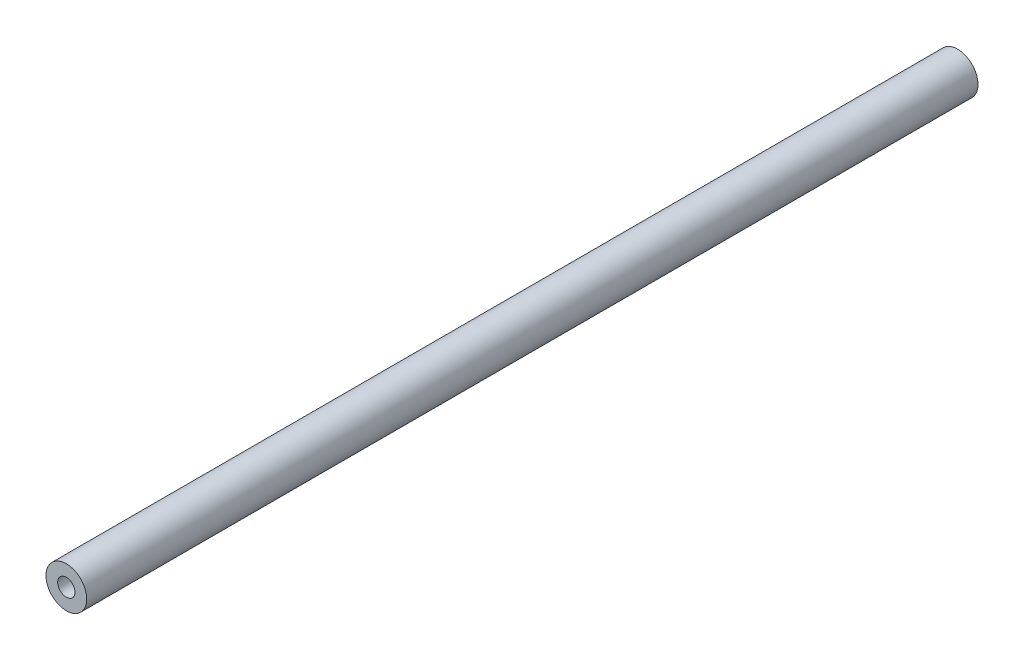
ISO-10303-21;
HEADER;
FILE_DESCRIPTION(('STEP AP214'),'2;1');
FILE_NAME('part.step','',(''),(''),'','','');
FILE_SCHEMA(('AUTOMOTIVE_DESIGN { 1 0 10303 214 1 1 1 1 }'));
ENDSEC;
DATA;
#1=APPLICATION_CONTEXT('core data for automotive mechanical design processes');
#2=APPLICATION_PROTOCOL_DEFINITION('international standard','automotive_design',2000,#1);
#3=PRODUCT_CONTEXT('',#1,'mechanical');
#4=PRODUCT('Part','Part','',(#3));
#5=PRODUCT_RELATED_PRODUCT_CATEGORY('part','',(#4));
#6=PRODUCT_DEFINITION_FORMATION('','',#4);
#7=PRODUCT_DEFINITION_CONTEXT('part definition',#1,'design');
#8=PRODUCT_DEFINITION('design','',#6,#7);
#9=PRODUCT_DEFINITION_SHAPE('','',#8);
#10=(LENGTH_UNIT() NAMED_UNIT(*) SI_UNIT(.MILLI.,.METRE.));
#11=(NAMED_UNIT(*) PLANE_ANGLE_UNIT() SI_UNIT($,.RADIAN.));
#12=(NAMED_UNIT(*) SI_UNIT($,.STERADIAN.) SOLID_ANGLE_UNIT());
#13=UNCERTAINTY_MEASURE_WITH_UNIT(LENGTH_MEASURE(1.E-05),#10,'distance_accuracy_value','');
#14=(GEOMETRIC_REPRESENTATION_CONTEXT(3) GLOBAL_UNCERTAINTY_ASSIGNED_CONTEXT((#13)) GLOBAL_UNIT_ASSIGNED_CONTEXT((#10,
#11,#12)) REPRESENTATION_CONTEXT('',''));
#15=CARTESIAN_POINT('',(0.,0.,0.));
#16=DIRECTION('',(0.,0.,1.));
#17=DIRECTION('',(1.,0.,0.));
#18=AXIS2_PLACEMENT_3D('',#15,#16,#17);
#19=CARTESIAN_POINT('',(0.,0.,350.));
#20=DIRECTION('',(0.,0.,-1.));
#21=DIRECTION('',(-1.,0.,0.));
#22=AXIS2_PLACEMENT_3D('',#19,#20,#21);
#23=CYLINDRICAL_SURFACE('',#22,8.);
#24=CARTESIAN_POINT('',(0.,0.,350.));
#25=DIRECTION('',(0.,0.,1.));
#26=DIRECTION('',(1.,0.,0.));
#27=AXIS2_PLACEMENT_3D('',#24,#25,#26);
#28=CIRCLE('',#27,8.);
#29=CARTESIAN_POINT('',(8.,0.,350.));
#30=VERTEX_POINT('',#29);
#31=EDGE_CURVE('E11',#30,#30,#28,.T.);
#32=ORIENTED_EDGE('',*,*,#31,.F.);
#33=EDGE_LOOP('',(#32));
#34=FACE_BOUND('',#33,.T.);
#35=CARTESIAN_POINT('',(0.,0.,0.));
#36=DIRECTION('',(0.,0.,1.));
#37=DIRECTION('',(1.,0.,0.));
#38=AXIS2_PLACEMENT_3D('',#35,#36,#37);
#39=CIRCLE('',#38,8.);
#40=CARTESIAN_POINT('',(8.,0.,0.));
#41=VERTEX_POINT('',#40);
#42=EDGE_CURVE('E40',#41,#41,#39,.T.);
#43=ORIENTED_EDGE('',*,*,#42,.T.);
#44=EDGE_LOOP('',(#43));
#45=FACE_BOUND('',#44,.T.);
#46=ADVANCED_FACE('F37',(#34,#45),#23,.T.);
#47=CARTESIAN_POINT('',(0.,0.,350.));
#48=DIRECTION('',(0.,0.,1.));
#49=DIRECTION('',(1.,0.,0.));
#50=AXIS2_PLACEMENT_3D('',#47,#48,#49);
#51=PLANE('',#50);
#52=CARTESIAN_POINT('',(0.,0.,350.));
#53=DIRECTION('',(0.,0.,1.));
#54=DIRECTION('',(1.,0.,0.));
#55=AXIS2_PLACEMENT_3D('',#52,#53,#54);
#56=CIRCLE('',#55,3.39999999999999);
#57=CARTESIAN_POINT('',(3.39999999999999,0.,350.));
#58=VERTEX_POINT('',#57);
#59=EDGE_CURVE('E60',#58,#58,#56,.T.);
#60=ORIENTED_EDGE('',*,*,#59,.F.);
#61=EDGE_LOOP('',(#60));
#62=FACE_BOUND('',#61,.T.);
#63=ORIENTED_EDGE('',*,*,#31,.T.);
#64=EDGE_LOOP('',(#63));
#65=FACE_BOUND('',#64,.T.);
#66=ADVANCED_FACE('F79',(#62,#65),#51,.T.);
#67=CARTESIAN_POINT('',(0.,0.,0.));
#68=DIRECTION('',(0.,0.,1.));
#69=DIRECTION('',(1.,0.,0.));
#70=AXIS2_PLACEMENT_3D('',#67,#68,#69);
#71=PLANE('',#70);
#72=CARTESIAN_POINT('',(0.,0.,0.));
#73=DIRECTION('',(0.,0.,-1.));
#74=DIRECTION('',(-1.,0.,0.));
#75=AXIS2_PLACEMENT_3D('',#72,#73,#74);
#76=CIRCLE('',#75,3.39999999999999);
#77=CARTESIAN_POINT('',(-3.39999999999999,0.,0.));
#78=VERTEX_POINT('',#77);
#79=EDGE_CURVE('E61',#78,#78,#76,.T.);
#80=ORIENTED_EDGE('',*,*,#79,.F.);
#81=EDGE_LOOP('',(#80));
#82=FACE_BOUND('',#81,.T.);
#83=ORIENTED_EDGE('',*,*,#42,.F.);
#84=EDGE_LOOP('',(#83));
#85=FACE_BOUND('',#84,.T.);
#86=ADVANCED_FACE('F76',(#82,#85),#71,.F.);
#87=CARTESIAN_POINT('',(0.,0.,323.75));
#88=DIRECTION('',(0.,0.,1.));
#89=DIRECTION('',(1.,0.,0.));
#90=AXIS2_PLACEMENT_3D('',#87,#88,#89);
#91=CONICAL_SURFACE('',#90,3.39999999999999,1.02974425867665);
#92=CARTESIAN_POINT('',(0.,0.,321.707073895306));
#93=VERTEX_POINT('',#92);
#94=VERTEX_LOOP('',#93);
#95=FACE_BOUND('',#94,.T.);
#96=CARTESIAN_POINT('',(0.,0.,323.75));
#97=DIRECTION('',(0.,0.,1.));
#98=DIRECTION('',(1.,0.,0.));
#99=AXIS2_PLACEMENT_3D('',#96,#97,#98);
#100=CIRCLE('',#99,3.39999999999999);
#101=CARTESIAN_POINT('',(3.39999999999999,0.,323.75));
#102=VERTEX_POINT('',#101);
#103=EDGE_CURVE('E64',#102,#102,#100,.T.);
#104=ORIENTED_EDGE('',*,*,#103,.T.);
#105=EDGE_LOOP('',(#104));
#106=FACE_BOUND('',#105,.T.);
#107=ADVANCED_FACE('F78',(#95,#106),#91,.F.);
#108=CARTESIAN_POINT('',(0.,0.,350.));
#109=DIRECTION('',(0.,0.,1.));
#110=DIRECTION('',(1.,0.,0.));
#111=AXIS2_PLACEMENT_3D('',#108,#109,#110);
#112=CYLINDRICAL_SURFACE('',#111,3.39999999999999);
#113=ORIENTED_EDGE('',*,*,#103,.F.);
#114=EDGE_LOOP('',(#113));
#115=FACE_BOUND('',#114,.T.);
#116=ORIENTED_EDGE('',*,*,#59,.T.);
#117=EDGE_LOOP('',(#116));
#118=FACE_BOUND('',#117,.T.);
#119=ADVANCED_FACE('F54',(#115,#118),#112,.F.);
#120=CARTESIAN_POINT('',(0.,0.,26.25));
#121=DIRECTION('',(0.,0.,-1.));
#122=DIRECTION('',(-1.,0.,0.));
#123=AXIS2_PLACEMENT_3D('',#120,#121,#122);
#124=CONICAL_SURFACE('',#123,3.39999999999999,1.02974425867665);
#125=CARTESIAN_POINT('',(0.,0.,28.2929261046937));
#126=VERTEX_POINT('',#125);
#127=VERTEX_LOOP('',#126);
#128=FACE_BOUND('',#127,.T.);
#129=CARTESIAN_POINT('',(0.,0.,26.25));
#130=DIRECTION('',(0.,0.,-1.));
#131=DIRECTION('',(-1.,0.,0.));
#132=AXIS2_PLACEMENT_3D('',#129,#130,#131);
#133=CIRCLE('',#132,3.39999999999999);
#134=CARTESIAN_POINT('',(-3.39999999999999,0.,26.25));
#135=VERTEX_POINT('',#134);
#136=EDGE_CURVE('E58',#135,#135,#133,.T.);
#137=ORIENTED_EDGE('',*,*,#136,.T.);
#138=EDGE_LOOP('',(#137));
#139=FACE_BOUND('',#138,.T.);
#140=ADVANCED_FACE('F50',(#128,#139),#124,.F.);
#141=CARTESIAN_POINT('',(0.,0.,0.));
#142=DIRECTION('',(0.,0.,-1.));
#143=DIRECTION('',(-1.,0.,0.));
#144=AXIS2_PLACEMENT_3D('',#141,#142,#143);
#145=CYLINDRICAL_SURFACE('',#144,3.39999999999999);
#146=ORIENTED_EDGE('',*,*,#136,.F.);
#147=EDGE_LOOP('',(#146));
#148=FACE_BOUND('',#147,.T.);
#149=ORIENTED_EDGE('',*,*,#79,.T.);
#150=EDGE_LOOP('',(#149));
#151=FACE_BOUND('',#150,.T.);
#152=ADVANCED_FACE('F53',(#148,#151),#145,.F.);
#153=CLOSED_SHELL('',(#46,#66,#86,#107,#119,#140,#152));
#154=MANIFOLD_SOLID_BREP('B2',#153);
#155=ADVANCED_BREP_SHAPE_REPRESENTATION('',(#18,#154),#14);
#156=SHAPE_DEFINITION_REPRESENTATION(#9,#155);
ENDSEC;
END-ISO-10303-21;
